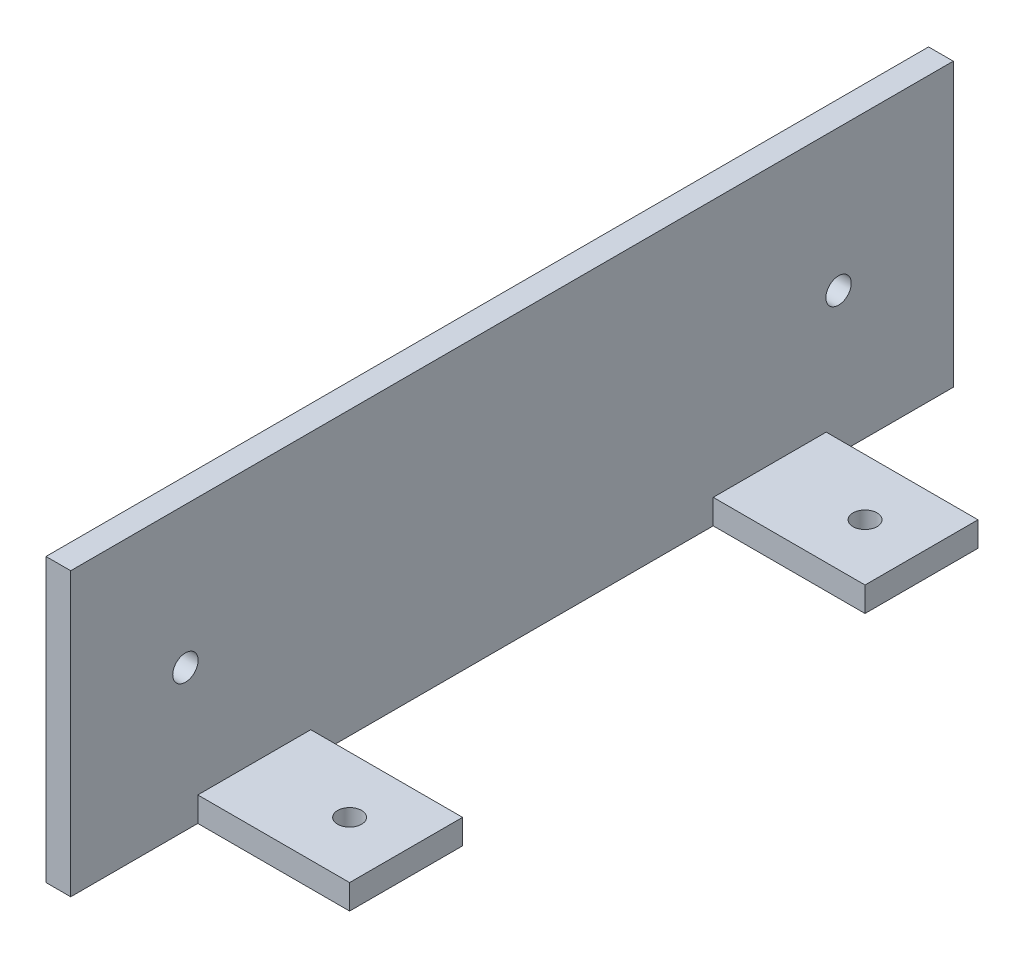
ISO-10303-21;
HEADER;
FILE_DESCRIPTION(('STEP AP214'),'2;1');
FILE_NAME('part.step','',(''),(''),'','','');
FILE_SCHEMA(('AUTOMOTIVE_DESIGN { 1 0 10303 214 1 1 1 1 }'));
ENDSEC;
DATA;
#1=APPLICATION_CONTEXT('core data for automotive mechanical design processes');
#2=APPLICATION_PROTOCOL_DEFINITION('international standard','automotive_design',2000,#1);
#3=PRODUCT_CONTEXT('',#1,'mechanical');
#4=PRODUCT('Part','Part','',(#3));
#5=PRODUCT_RELATED_PRODUCT_CATEGORY('part','',(#4));
#6=PRODUCT_DEFINITION_FORMATION('','',#4);
#7=PRODUCT_DEFINITION_CONTEXT('part definition',#1,'design');
#8=PRODUCT_DEFINITION('design','',#6,#7);
#9=PRODUCT_DEFINITION_SHAPE('','',#8);
#10=(LENGTH_UNIT() NAMED_UNIT(*) SI_UNIT(.MILLI.,.METRE.));
#11=(NAMED_UNIT(*) PLANE_ANGLE_UNIT() SI_UNIT($,.RADIAN.));
#12=(NAMED_UNIT(*) SI_UNIT($,.STERADIAN.) SOLID_ANGLE_UNIT());
#13=UNCERTAINTY_MEASURE_WITH_UNIT(LENGTH_MEASURE(1.E-05),#10,'distance_accuracy_value','');
#14=(GEOMETRIC_REPRESENTATION_CONTEXT(3) GLOBAL_UNCERTAINTY_ASSIGNED_CONTEXT((#13)) GLOBAL_UNIT_ASSIGNED_CONTEXT((#10,
#11,#12)) REPRESENTATION_CONTEXT('',''));
#15=CARTESIAN_POINT('',(0.,0.,0.));
#16=DIRECTION('',(0.,0.,1.));
#17=DIRECTION('',(1.,0.,0.));
#18=AXIS2_PLACEMENT_3D('',#15,#16,#17);
#19=CARTESIAN_POINT('',(25.,3.5,-62.5));
#20=DIRECTION('',(-1.,0.,0.));
#21=DIRECTION('',(0.,0.,1.));
#22=AXIS2_PLACEMENT_3D('',#19,#20,#21);
#23=PLANE('',#22);
#24=DIRECTION('',(0.,0.,1.));
#25=VECTOR('',#24,1.);
#26=CARTESIAN_POINT('',(25.,3.5,-62.5));
#27=LINE('',#26,#25);
#28=CARTESIAN_POINT('',(25.,3.5,-44.5));
#29=VERTEX_POINT('',#28);
#30=CARTESIAN_POINT('',(25.,3.5,-28.5));
#31=VERTEX_POINT('',#30);
#32=EDGE_CURVE('E141',#29,#31,#27,.T.);
#33=ORIENTED_EDGE('',*,*,#32,.T.);
#34=DIRECTION('',(0.,1.,0.));
#35=VECTOR('',#34,1.);
#36=CARTESIAN_POINT('',(25.,-59.,-28.5));
#37=LINE('',#36,#35);
#38=CARTESIAN_POINT('',(25.,0.,-28.5));
#39=VERTEX_POINT('',#38);
#40=EDGE_CURVE('E124',#39,#31,#37,.T.);
#41=ORIENTED_EDGE('',*,*,#40,.F.);
#42=DIRECTION('',(0.,0.,1.));
#43=VECTOR('',#42,1.);
#44=CARTESIAN_POINT('',(25.,0.,-62.5));
#45=LINE('',#44,#43);
#46=CARTESIAN_POINT('',(25.,0.,-44.5));
#47=VERTEX_POINT('',#46);
#48=EDGE_CURVE('E11',#47,#39,#45,.T.);
#49=ORIENTED_EDGE('',*,*,#48,.F.);
#50=DIRECTION('',(0.,1.,0.));
#51=VECTOR('',#50,1.);
#52=CARTESIAN_POINT('',(25.,-59.,-44.5));
#53=LINE('',#52,#51);
#54=EDGE_CURVE('E146',#47,#29,#53,.T.);
#55=ORIENTED_EDGE('',*,*,#54,.T.);
#56=EDGE_LOOP('',(#33,#41,#49,#55));
#57=FACE_BOUND('',#56,.T.);
#58=ADVANCED_FACE('F33',(#57),#23,.F.);
#59=CARTESIAN_POINT('',(3.5,3.5,-62.5));
#60=DIRECTION('',(0.,-1.,0.));
#61=DIRECTION('',(0.,0.,-1.));
#62=AXIS2_PLACEMENT_3D('',#59,#60,#61);
#63=PLANE('',#62);
#64=CARTESIAN_POINT('',(17.,3.5,-36.5));
#65=DIRECTION('',(0.,1.,0.));
#66=DIRECTION('',(-1.,0.,0.));
#67=AXIS2_PLACEMENT_3D('',#64,#65,#66);
#68=CIRCLE('',#67,1.7);
#69=CARTESIAN_POINT('',(15.3,3.5,-36.5));
#70=VERTEX_POINT('',#69);
#71=EDGE_CURVE('E255',#70,#70,#68,.T.);
#72=ORIENTED_EDGE('',*,*,#71,.F.);
#73=EDGE_LOOP('',(#72));
#74=FACE_BOUND('',#73,.T.);
#75=DIRECTION('',(0.,0.,1.));
#76=VECTOR('',#75,1.);
#77=CARTESIAN_POINT('',(3.5,3.5,-62.5));
#78=LINE('',#77,#76);
#79=CARTESIAN_POINT('',(3.50000000000001,3.5,-44.5));
#80=VERTEX_POINT('',#79);
#81=CARTESIAN_POINT('',(3.50000000000001,3.5,-28.5));
#82=VERTEX_POINT('',#81);
#83=EDGE_CURVE('E143',#80,#82,#78,.T.);
#84=ORIENTED_EDGE('',*,*,#83,.T.);
#85=DIRECTION('',(-1.,0.,0.));
#86=VECTOR('',#85,1.);
#87=CARTESIAN_POINT('',(25.,3.5,-28.5));
#88=LINE('',#87,#86);
#89=EDGE_CURVE('E128',#31,#82,#88,.T.);
#90=ORIENTED_EDGE('',*,*,#89,.F.);
#91=ORIENTED_EDGE('',*,*,#32,.F.);
#92=DIRECTION('',(1.,0.,0.));
#93=VECTOR('',#92,1.);
#94=CARTESIAN_POINT('',(3.50000000000001,3.5,-44.5));
#95=LINE('',#94,#93);
#96=EDGE_CURVE('E238',#80,#29,#95,.T.);
#97=ORIENTED_EDGE('',*,*,#96,.F.);
#98=EDGE_LOOP('',(#84,#90,#91,#97));
#99=FACE_BOUND('',#98,.T.);
#100=ADVANCED_FACE('F139',(#74,#99),#63,.F.);
#101=CARTESIAN_POINT('',(25.,0.,28.5));
#102=VERTEX_POINT('',#101);
#103=CARTESIAN_POINT('',(25.,0.,44.5));
#104=VERTEX_POINT('',#103);
#105=EDGE_CURVE('E42',#102,#104,#45,.T.);
#106=ORIENTED_EDGE('',*,*,#105,.F.);
#107=DIRECTION('',(0.,1.,0.));
#108=VECTOR('',#107,1.);
#109=CARTESIAN_POINT('',(25.,-59.,28.5));
#110=LINE('',#109,#108);
#111=CARTESIAN_POINT('',(25.,3.5,28.5));
#112=VERTEX_POINT('',#111);
#113=EDGE_CURVE('E247',#102,#112,#110,.T.);
#114=ORIENTED_EDGE('',*,*,#113,.T.);
#115=CARTESIAN_POINT('',(25.,3.5,44.5));
#116=VERTEX_POINT('',#115);
#117=EDGE_CURVE('E148',#112,#116,#27,.T.);
#118=ORIENTED_EDGE('',*,*,#117,.T.);
#119=DIRECTION('',(0.,1.,0.));
#120=VECTOR('',#119,1.);
#121=CARTESIAN_POINT('',(25.,-59.,44.5));
#122=LINE('',#121,#120);
#123=EDGE_CURVE('E228',#104,#116,#122,.T.);
#124=ORIENTED_EDGE('',*,*,#123,.F.);
#125=EDGE_LOOP('',(#106,#114,#118,#124));
#126=FACE_BOUND('',#125,.T.);
#127=ADVANCED_FACE('F35',(#126),#23,.F.);
#128=CARTESIAN_POINT('',(25.,0.,-62.5));
#129=DIRECTION('',(0.,1.,0.));
#130=DIRECTION('',(-1.,0.,0.));
#131=AXIS2_PLACEMENT_3D('',#128,#129,#130);
#132=PLANE('',#131);
#133=CARTESIAN_POINT('',(17.,0.,36.5));
#134=DIRECTION('',(0.,1.,0.));
#135=DIRECTION('',(-1.,0.,0.));
#136=AXIS2_PLACEMENT_3D('',#133,#134,#135);
#137=CIRCLE('',#136,1.7);
#138=CARTESIAN_POINT('',(15.3,0.,36.5));
#139=VERTEX_POINT('',#138);
#140=EDGE_CURVE('E258',#139,#139,#137,.T.);
#141=ORIENTED_EDGE('',*,*,#140,.T.);
#142=EDGE_LOOP('',(#141));
#143=FACE_BOUND('',#142,.T.);
#144=CARTESIAN_POINT('',(17.,0.,-36.5));
#145=DIRECTION('',(0.,1.,0.));
#146=DIRECTION('',(-1.,0.,0.));
#147=AXIS2_PLACEMENT_3D('',#144,#145,#146);
#148=CIRCLE('',#147,1.7);
#149=CARTESIAN_POINT('',(15.3,0.,-36.5));
#150=VERTEX_POINT('',#149);
#151=EDGE_CURVE('E37',#150,#150,#148,.T.);
#152=ORIENTED_EDGE('',*,*,#151,.T.);
#153=EDGE_LOOP('',(#152));
#154=FACE_BOUND('',#153,.T.);
#155=DIRECTION('',(-1.,0.,0.));
#156=VECTOR('',#155,1.);
#157=CARTESIAN_POINT('',(25.,0.,-28.5));
#158=LINE('',#157,#156);
#159=CARTESIAN_POINT('',(3.50000000000001,0.,-28.5));
#160=VERTEX_POINT('',#159);
#161=EDGE_CURVE('E131',#39,#160,#158,.T.);
#162=ORIENTED_EDGE('',*,*,#161,.T.);
#163=DIRECTION('',(0.,0.,1.));
#164=VECTOR('',#163,1.);
#165=CARTESIAN_POINT('',(3.5,0.,-62.5));
#166=LINE('',#165,#164);
#167=CARTESIAN_POINT('',(3.50000000000001,0.,28.5));
#168=VERTEX_POINT('',#167);
#169=EDGE_CURVE('E241',#160,#168,#166,.T.);
#170=ORIENTED_EDGE('',*,*,#169,.T.);
#171=DIRECTION('',(1.,0.,0.));
#172=VECTOR('',#171,1.);
#173=CARTESIAN_POINT('',(25.,0.,28.5));
#174=LINE('',#173,#172);
#175=EDGE_CURVE('E244',#168,#102,#174,.T.);
#176=ORIENTED_EDGE('',*,*,#175,.T.);
#177=ORIENTED_EDGE('',*,*,#105,.T.);
#178=DIRECTION('',(-1.,0.,0.));
#179=VECTOR('',#178,1.);
#180=CARTESIAN_POINT('',(25.,0.,44.5));
#181=LINE('',#180,#179);
#182=CARTESIAN_POINT('',(3.5,0.,44.5));
#183=VERTEX_POINT('',#182);
#184=EDGE_CURVE('E173',#104,#183,#181,.T.);
#185=ORIENTED_EDGE('',*,*,#184,.T.);
#186=DIRECTION('',(0.,0.,1.));
#187=VECTOR('',#186,1.);
#188=CARTESIAN_POINT('',(3.5,0.,-62.5));
#189=LINE('',#188,#187);
#190=CARTESIAN_POINT('',(3.5,0.,62.5));
#191=VERTEX_POINT('',#190);
#192=EDGE_CURVE('E178',#183,#191,#189,.T.);
#193=ORIENTED_EDGE('',*,*,#192,.T.);
#194=DIRECTION('',(-1.,0.,0.));
#195=VECTOR('',#194,1.);
#196=CARTESIAN_POINT('',(25.,0.,62.5));
#197=LINE('',#196,#195);
#198=CARTESIAN_POINT('',(0.,0.,62.5));
#199=VERTEX_POINT('',#198);
#200=EDGE_CURVE('E163',#191,#199,#197,.T.);
#201=ORIENTED_EDGE('',*,*,#200,.T.);
#202=DIRECTION('',(0.,0.,1.));
#203=VECTOR('',#202,1.);
#204=CARTESIAN_POINT('',(0.,0.,-62.5));
#205=LINE('',#204,#203);
#206=CARTESIAN_POINT('',(0.,0.,-62.5));
#207=VERTEX_POINT('',#206);
#208=EDGE_CURVE('E158',#207,#199,#205,.T.);
#209=ORIENTED_EDGE('',*,*,#208,.F.);
#210=DIRECTION('',(-1.,0.,0.));
#211=VECTOR('',#210,1.);
#212=CARTESIAN_POINT('',(25.,0.,-62.5));
#213=LINE('',#212,#211);
#214=CARTESIAN_POINT('',(3.5,0.,-62.5));
#215=VERTEX_POINT('',#214);
#216=EDGE_CURVE('E191',#215,#207,#213,.T.);
#217=ORIENTED_EDGE('',*,*,#216,.F.);
#218=DIRECTION('',(0.,0.,1.));
#219=VECTOR('',#218,1.);
#220=CARTESIAN_POINT('',(3.5,0.,-62.5));
#221=LINE('',#220,#219);
#222=CARTESIAN_POINT('',(3.50000000000001,0.,-44.5));
#223=VERTEX_POINT('',#222);
#224=EDGE_CURVE('E208',#215,#223,#221,.T.);
#225=ORIENTED_EDGE('',*,*,#224,.T.);
#226=DIRECTION('',(1.,0.,0.));
#227=VECTOR('',#226,1.);
#228=CARTESIAN_POINT('',(25.,0.,-44.5));
#229=LINE('',#228,#227);
#230=EDGE_CURVE('E213',#223,#47,#229,.T.);
#231=ORIENTED_EDGE('',*,*,#230,.T.);
#232=ORIENTED_EDGE('',*,*,#48,.T.);
#233=EDGE_LOOP('',(#162,#170,#176,#177,#185,#193,#201,#209,#217,#225,#231,#232));
#234=FACE_BOUND('',#233,.T.);
#235=ADVANCED_FACE('F216',(#143,#154,#234),#132,.F.);
#236=CARTESIAN_POINT('',(0.,0.,-62.5));
#237=DIRECTION('',(1.,0.,0.));
#238=DIRECTION('',(0.,0.,-1.));
#239=AXIS2_PLACEMENT_3D('',#236,#237,#238);
#240=PLANE('',#239);
#241=CARTESIAN_POINT('',(0.,20.,46.25));
#242=DIRECTION('',(-1.,0.,0.));
#243=DIRECTION('',(0.,0.,1.));
#244=AXIS2_PLACEMENT_3D('',#241,#242,#243);
#245=CIRCLE('',#244,1.8);
#246=CARTESIAN_POINT('',(0.,20.,48.05));
#247=VERTEX_POINT('',#246);
#248=EDGE_CURVE('E167',#247,#247,#245,.T.);
#249=ORIENTED_EDGE('',*,*,#248,.F.);
#250=EDGE_LOOP('',(#249));
#251=FACE_BOUND('',#250,.T.);
#252=CARTESIAN_POINT('',(0.,20.,-46.25));
#253=DIRECTION('',(-1.,0.,0.));
#254=DIRECTION('',(0.,0.,1.));
#255=AXIS2_PLACEMENT_3D('',#252,#253,#254);
#256=CIRCLE('',#255,1.8);
#257=CARTESIAN_POINT('',(0.,20.,-44.45));
#258=VERTEX_POINT('',#257);
#259=EDGE_CURVE('E164',#258,#258,#256,.T.);
#260=ORIENTED_EDGE('',*,*,#259,.F.);
#261=EDGE_LOOP('',(#260));
#262=FACE_BOUND('',#261,.T.);
#263=ORIENTED_EDGE('',*,*,#208,.T.);
#264=DIRECTION('',(0.,1.,0.));
#265=VECTOR('',#264,1.);
#266=CARTESIAN_POINT('',(0.,0.,62.5));
#267=LINE('',#266,#265);
#268=CARTESIAN_POINT('',(0.,40.,62.5));
#269=VERTEX_POINT('',#268);
#270=EDGE_CURVE('E183',#199,#269,#267,.T.);
#271=ORIENTED_EDGE('',*,*,#270,.T.);
#272=DIRECTION('',(0.,0.,1.));
#273=VECTOR('',#272,1.);
#274=CARTESIAN_POINT('',(0.,40.,-62.5));
#275=LINE('',#274,#273);
#276=CARTESIAN_POINT('',(0.,40.,-62.5));
#277=VERTEX_POINT('',#276);
#278=EDGE_CURVE('E156',#277,#269,#275,.T.);
#279=ORIENTED_EDGE('',*,*,#278,.F.);
#280=DIRECTION('',(0.,1.,0.));
#281=VECTOR('',#280,1.);
#282=CARTESIAN_POINT('',(0.,0.,-62.5));
#283=LINE('',#282,#281);
#284=EDGE_CURVE('E193',#207,#277,#283,.T.);
#285=ORIENTED_EDGE('',*,*,#284,.F.);
#286=EDGE_LOOP('',(#263,#271,#279,#285));
#287=FACE_BOUND('',#286,.T.);
#288=ADVANCED_FACE('F221',(#251,#262,#287),#240,.F.);
#289=CARTESIAN_POINT('',(0.,40.,-62.5));
#290=DIRECTION('',(0.,-1.,0.));
#291=DIRECTION('',(0.,0.,-1.));
#292=AXIS2_PLACEMENT_3D('',#289,#290,#291);
#293=PLANE('',#292);
#294=ORIENTED_EDGE('',*,*,#278,.T.);
#295=DIRECTION('',(1.,0.,0.));
#296=VECTOR('',#295,1.);
#297=CARTESIAN_POINT('',(0.,40.,62.5));
#298=LINE('',#297,#296);
#299=CARTESIAN_POINT('',(3.5,40.,62.5));
#300=VERTEX_POINT('',#299);
#301=EDGE_CURVE('E186',#269,#300,#298,.T.);
#302=ORIENTED_EDGE('',*,*,#301,.T.);
#303=DIRECTION('',(0.,0.,1.));
#304=VECTOR('',#303,1.);
#305=CARTESIAN_POINT('',(3.5,40.,-62.5));
#306=LINE('',#305,#304);
#307=CARTESIAN_POINT('',(3.5,40.,-62.5));
#308=VERTEX_POINT('',#307);
#309=EDGE_CURVE('E154',#308,#300,#306,.T.);
#310=ORIENTED_EDGE('',*,*,#309,.F.);
#311=DIRECTION('',(1.,0.,0.));
#312=VECTOR('',#311,1.);
#313=CARTESIAN_POINT('',(0.,40.,-62.5));
#314=LINE('',#313,#312);
#315=EDGE_CURVE('E194',#277,#308,#314,.T.);
#316=ORIENTED_EDGE('',*,*,#315,.F.);
#317=EDGE_LOOP('',(#294,#302,#310,#316));
#318=FACE_BOUND('',#317,.T.);
#319=ADVANCED_FACE('F201',(#318),#293,.F.);
#320=CARTESIAN_POINT('',(3.5,40.,-62.5));
#321=DIRECTION('',(-1.,0.,0.));
#322=DIRECTION('',(0.,-1.,0.));
#323=AXIS2_PLACEMENT_3D('',#320,#321,#322);
#324=PLANE('',#323);
#325=CARTESIAN_POINT('',(3.5,20.,46.25));
#326=DIRECTION('',(-1.,0.,0.));
#327=DIRECTION('',(0.,-1.,0.));
#328=AXIS2_PLACEMENT_3D('',#325,#326,#327);
#329=CIRCLE('',#328,1.8);
#330=CARTESIAN_POINT('',(3.5,18.2,46.25));
#331=VERTEX_POINT('',#330);
#332=EDGE_CURVE('E165',#331,#331,#329,.T.);
#333=ORIENTED_EDGE('',*,*,#332,.T.);
#334=EDGE_LOOP('',(#333));
#335=FACE_BOUND('',#334,.T.);
#336=CARTESIAN_POINT('',(3.5,20.,-46.25));
#337=DIRECTION('',(-1.,0.,0.));
#338=DIRECTION('',(0.,-1.,0.));
#339=AXIS2_PLACEMENT_3D('',#336,#337,#338);
#340=CIRCLE('',#339,1.8);
#341=CARTESIAN_POINT('',(3.5,18.2,-46.25));
#342=VERTEX_POINT('',#341);
#343=EDGE_CURVE('E161',#342,#342,#340,.T.);
#344=ORIENTED_EDGE('',*,*,#343,.T.);
#345=EDGE_LOOP('',(#344));
#346=FACE_BOUND('',#345,.T.);
#347=ORIENTED_EDGE('',*,*,#309,.T.);
#348=DIRECTION('',(0.,-1.,0.));
#349=VECTOR('',#348,1.);
#350=CARTESIAN_POINT('',(3.5,40.,62.5));
#351=LINE('',#350,#349);
#352=EDGE_CURVE('E189',#300,#191,#351,.T.);
#353=ORIENTED_EDGE('',*,*,#352,.T.);
#354=ORIENTED_EDGE('',*,*,#192,.F.);
#355=DIRECTION('',(0.,1.,0.));
#356=VECTOR('',#355,1.);
#357=CARTESIAN_POINT('',(3.5,-59.,44.5));
#358=LINE('',#357,#356);
#359=CARTESIAN_POINT('',(3.5,3.5,44.5));
#360=VERTEX_POINT('',#359);
#361=EDGE_CURVE('E227',#183,#360,#358,.T.);
#362=ORIENTED_EDGE('',*,*,#361,.T.);
#363=CARTESIAN_POINT('',(3.5,3.5,28.5));
#364=VERTEX_POINT('',#363);
#365=EDGE_CURVE('E147',#364,#360,#78,.T.);
#366=ORIENTED_EDGE('',*,*,#365,.F.);
#367=DIRECTION('',(0.,1.,0.));
#368=VECTOR('',#367,1.);
#369=CARTESIAN_POINT('',(3.50000000000001,-59.,28.5));
#370=LINE('',#369,#368);
#371=EDGE_CURVE('E50',#168,#364,#370,.T.);
#372=ORIENTED_EDGE('',*,*,#371,.F.);
#373=ORIENTED_EDGE('',*,*,#169,.F.);
#374=DIRECTION('',(0.,1.,0.));
#375=VECTOR('',#374,1.);
#376=CARTESIAN_POINT('',(3.50000000000001,-59.,-28.5));
#377=LINE('',#376,#375);
#378=EDGE_CURVE('E135',#160,#82,#377,.T.);
#379=ORIENTED_EDGE('',*,*,#378,.T.);
#380=ORIENTED_EDGE('',*,*,#83,.F.);
#381=DIRECTION('',(0.,1.,0.));
#382=VECTOR('',#381,1.);
#383=CARTESIAN_POINT('',(3.50000000000001,-59.,-44.5));
#384=LINE('',#383,#382);
#385=EDGE_CURVE('E210',#223,#80,#384,.T.);
#386=ORIENTED_EDGE('',*,*,#385,.F.);
#387=ORIENTED_EDGE('',*,*,#224,.F.);
#388=DIRECTION('',(0.,-1.,0.));
#389=VECTOR('',#388,1.);
#390=CARTESIAN_POINT('',(3.5,40.,-62.5));
#391=LINE('',#390,#389);
#392=EDGE_CURVE('E58',#308,#215,#391,.T.);
#393=ORIENTED_EDGE('',*,*,#392,.F.);
#394=EDGE_LOOP('',(#347,#353,#354,#362,#366,#372,#373,#379,#380,#386,#387,#393));
#395=FACE_BOUND('',#394,.T.);
#396=ADVANCED_FACE('F205',(#335,#346,#395),#324,.F.);
#397=CARTESIAN_POINT('',(17.,3.5,36.5));
#398=DIRECTION('',(0.,1.,0.));
#399=DIRECTION('',(-1.,0.,0.));
#400=AXIS2_PLACEMENT_3D('',#397,#398,#399);
#401=CIRCLE('',#400,1.7);
#402=CARTESIAN_POINT('',(15.3,3.5,36.5));
#403=VERTEX_POINT('',#402);
#404=EDGE_CURVE('E261',#403,#403,#401,.T.);
#405=ORIENTED_EDGE('',*,*,#404,.F.);
#406=EDGE_LOOP('',(#405));
#407=FACE_BOUND('',#406,.T.);
#408=ORIENTED_EDGE('',*,*,#117,.F.);
#409=DIRECTION('',(1.,0.,0.));
#410=VECTOR('',#409,1.);
#411=CARTESIAN_POINT('',(3.50000000000001,3.5,28.5));
#412=LINE('',#411,#410);
#413=EDGE_CURVE('E249',#364,#112,#412,.T.);
#414=ORIENTED_EDGE('',*,*,#413,.F.);
#415=ORIENTED_EDGE('',*,*,#365,.T.);
#416=DIRECTION('',(-1.,0.,0.));
#417=VECTOR('',#416,1.);
#418=CARTESIAN_POINT('',(3.5,3.5,44.5));
#419=LINE('',#418,#417);
#420=EDGE_CURVE('E232',#116,#360,#419,.T.);
#421=ORIENTED_EDGE('',*,*,#420,.F.);
#422=EDGE_LOOP('',(#408,#414,#415,#421));
#423=FACE_BOUND('',#422,.T.);
#424=ADVANCED_FACE('F268',(#407,#423),#63,.F.);
#425=CARTESIAN_POINT('',(0.,0.,-62.5));
#426=DIRECTION('',(0.,0.,-1.));
#427=DIRECTION('',(-1.,0.,0.));
#428=AXIS2_PLACEMENT_3D('',#425,#426,#427);
#429=PLANE('',#428);
#430=ORIENTED_EDGE('',*,*,#392,.T.);
#431=ORIENTED_EDGE('',*,*,#216,.T.);
#432=ORIENTED_EDGE('',*,*,#284,.T.);
#433=ORIENTED_EDGE('',*,*,#315,.T.);
#434=EDGE_LOOP('',(#430,#431,#432,#433));
#435=FACE_BOUND('',#434,.T.);
#436=ADVANCED_FACE('F197',(#435),#429,.T.);
#437=CARTESIAN_POINT('',(0.,0.,62.5));
#438=DIRECTION('',(0.,0.,-1.));
#439=DIRECTION('',(-1.,0.,0.));
#440=AXIS2_PLACEMENT_3D('',#437,#438,#439);
#441=PLANE('',#440);
#442=ORIENTED_EDGE('',*,*,#200,.F.);
#443=ORIENTED_EDGE('',*,*,#352,.F.);
#444=ORIENTED_EDGE('',*,*,#301,.F.);
#445=ORIENTED_EDGE('',*,*,#270,.F.);
#446=EDGE_LOOP('',(#442,#443,#444,#445));
#447=FACE_BOUND('',#446,.T.);
#448=ADVANCED_FACE('F223',(#447),#441,.F.);
#449=CARTESIAN_POINT('',(62.5,20.,-46.25));
#450=DIRECTION('',(-1.,0.,0.));
#451=DIRECTION('',(0.,0.,1.));
#452=AXIS2_PLACEMENT_3D('',#449,#450,#451);
#453=CYLINDRICAL_SURFACE('',#452,1.8);
#454=ORIENTED_EDGE('',*,*,#259,.T.);
#455=EDGE_LOOP('',(#454));
#456=FACE_BOUND('',#455,.T.);
#457=ORIENTED_EDGE('',*,*,#343,.F.);
#458=EDGE_LOOP('',(#457));
#459=FACE_BOUND('',#458,.T.);
#460=ADVANCED_FACE('F317',(#456,#459),#453,.F.);
#461=CARTESIAN_POINT('',(62.5,20.,46.25));
#462=DIRECTION('',(-1.,0.,0.));
#463=DIRECTION('',(0.,0.,1.));
#464=AXIS2_PLACEMENT_3D('',#461,#462,#463);
#465=CYLINDRICAL_SURFACE('',#464,1.8);
#466=ORIENTED_EDGE('',*,*,#248,.T.);
#467=EDGE_LOOP('',(#466));
#468=FACE_BOUND('',#467,.T.);
#469=ORIENTED_EDGE('',*,*,#332,.F.);
#470=EDGE_LOOP('',(#469));
#471=FACE_BOUND('',#470,.T.);
#472=ADVANCED_FACE('F290',(#468,#471),#465,.F.);
#473=CARTESIAN_POINT('',(3.5,-59.,44.5));
#474=DIRECTION('',(0.,0.,-1.));
#475=DIRECTION('',(-1.,0.,0.));
#476=AXIS2_PLACEMENT_3D('',#473,#474,#475);
#477=PLANE('',#476);
#478=ORIENTED_EDGE('',*,*,#123,.T.);
#479=ORIENTED_EDGE('',*,*,#420,.T.);
#480=ORIENTED_EDGE('',*,*,#361,.F.);
#481=ORIENTED_EDGE('',*,*,#184,.F.);
#482=EDGE_LOOP('',(#478,#479,#480,#481));
#483=FACE_BOUND('',#482,.T.);
#484=ADVANCED_FACE('F279',(#483),#477,.F.);
#485=CARTESIAN_POINT('',(3.50000000000001,-59.,-44.5));
#486=DIRECTION('',(0.,0.,1.));
#487=DIRECTION('',(1.,0.,0.));
#488=AXIS2_PLACEMENT_3D('',#485,#486,#487);
#489=PLANE('',#488);
#490=ORIENTED_EDGE('',*,*,#385,.T.);
#491=ORIENTED_EDGE('',*,*,#96,.T.);
#492=ORIENTED_EDGE('',*,*,#54,.F.);
#493=ORIENTED_EDGE('',*,*,#230,.F.);
#494=EDGE_LOOP('',(#490,#491,#492,#493));
#495=FACE_BOUND('',#494,.T.);
#496=ADVANCED_FACE('F281',(#495),#489,.F.);
#497=CARTESIAN_POINT('',(3.50000000000001,-59.,28.5));
#498=DIRECTION('',(0.,0.,1.));
#499=DIRECTION('',(1.,0.,0.));
#500=AXIS2_PLACEMENT_3D('',#497,#498,#499);
#501=PLANE('',#500);
#502=ORIENTED_EDGE('',*,*,#371,.T.);
#503=ORIENTED_EDGE('',*,*,#413,.T.);
#504=ORIENTED_EDGE('',*,*,#113,.F.);
#505=ORIENTED_EDGE('',*,*,#175,.F.);
#506=EDGE_LOOP('',(#502,#503,#504,#505));
#507=FACE_BOUND('',#506,.T.);
#508=ADVANCED_FACE('F283',(#507),#501,.F.);
#509=CARTESIAN_POINT('',(25.,-59.,-28.5));
#510=DIRECTION('',(0.,0.,-1.));
#511=DIRECTION('',(-1.,0.,0.));
#512=AXIS2_PLACEMENT_3D('',#509,#510,#511);
#513=PLANE('',#512);
#514=ORIENTED_EDGE('',*,*,#40,.T.);
#515=ORIENTED_EDGE('',*,*,#89,.T.);
#516=ORIENTED_EDGE('',*,*,#378,.F.);
#517=ORIENTED_EDGE('',*,*,#161,.F.);
#518=EDGE_LOOP('',(#514,#515,#516,#517));
#519=FACE_BOUND('',#518,.T.);
#520=ADVANCED_FACE('F126',(#519),#513,.F.);
#521=CARTESIAN_POINT('',(17.,-59.,-36.5));
#522=DIRECTION('',(0.,1.,0.));
#523=DIRECTION('',(-1.,0.,0.));
#524=AXIS2_PLACEMENT_3D('',#521,#522,#523);
#525=CYLINDRICAL_SURFACE('',#524,1.7);
#526=ORIENTED_EDGE('',*,*,#71,.T.);
#527=EDGE_LOOP('',(#526));
#528=FACE_BOUND('',#527,.T.);
#529=ORIENTED_EDGE('',*,*,#151,.F.);
#530=EDGE_LOOP('',(#529));
#531=FACE_BOUND('',#530,.T.);
#532=ADVANCED_FACE('F380',(#528,#531),#525,.F.);
#533=CARTESIAN_POINT('',(17.,-59.,36.5));
#534=DIRECTION('',(0.,1.,0.));
#535=DIRECTION('',(-1.,0.,0.));
#536=AXIS2_PLACEMENT_3D('',#533,#534,#535);
#537=CYLINDRICAL_SURFACE('',#536,1.7);
#538=ORIENTED_EDGE('',*,*,#404,.T.);
#539=EDGE_LOOP('',(#538));
#540=FACE_BOUND('',#539,.T.);
#541=ORIENTED_EDGE('',*,*,#140,.F.);
#542=EDGE_LOOP('',(#541));
#543=FACE_BOUND('',#542,.T.);
#544=ADVANCED_FACE('F265',(#540,#543),#537,.F.);
#545=CLOSED_SHELL('',(#58,#100,#127,#235,#288,#319,#396,#424,#436,#448,#460,#472,#484,#496,#508,
#520,#532,#544));
#546=MANIFOLD_SOLID_BREP('B2',#545);
#547=ADVANCED_BREP_SHAPE_REPRESENTATION('',(#18,#546),#14);
#548=SHAPE_DEFINITION_REPRESENTATION(#9,#547);
ENDSEC;
END-ISO-10303-21;
